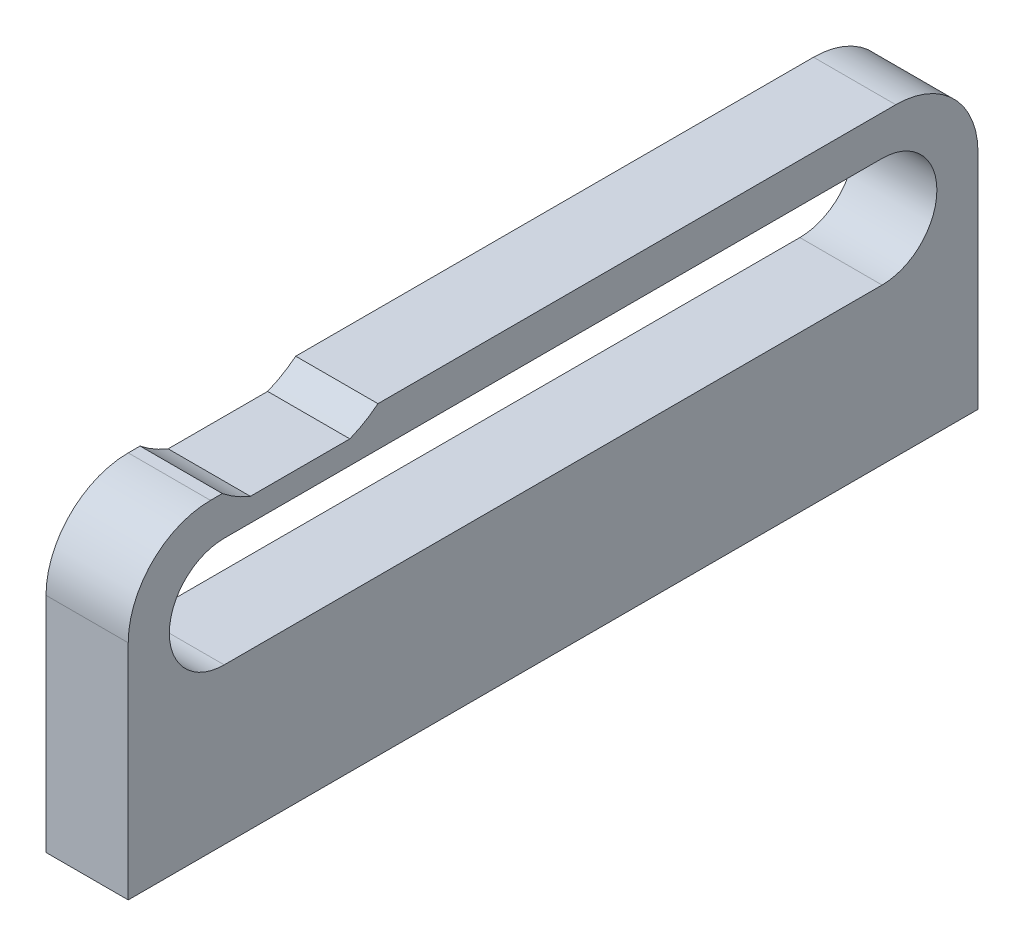
ISO-10303-21;
HEADER;
FILE_DESCRIPTION(('STEP AP214'),'2;1');
FILE_NAME('part.step','',(''),(''),'','','');
FILE_SCHEMA(('AUTOMOTIVE_DESIGN { 1 0 10303 214 1 1 1 1 }'));
ENDSEC;
DATA;
#1=APPLICATION_CONTEXT('core data for automotive mechanical design processes');
#2=APPLICATION_PROTOCOL_DEFINITION('international standard','automotive_design',2000,#1);
#3=PRODUCT_CONTEXT('',#1,'mechanical');
#4=PRODUCT('Part','Part','',(#3));
#5=PRODUCT_RELATED_PRODUCT_CATEGORY('part','',(#4));
#6=PRODUCT_DEFINITION_FORMATION('','',#4);
#7=PRODUCT_DEFINITION_CONTEXT('part definition',#1,'design');
#8=PRODUCT_DEFINITION('design','',#6,#7);
#9=PRODUCT_DEFINITION_SHAPE('','',#8);
#10=(LENGTH_UNIT() NAMED_UNIT(*) SI_UNIT(.MILLI.,.METRE.));
#11=(NAMED_UNIT(*) PLANE_ANGLE_UNIT() SI_UNIT($,.RADIAN.));
#12=(NAMED_UNIT(*) SI_UNIT($,.STERADIAN.) SOLID_ANGLE_UNIT());
#13=UNCERTAINTY_MEASURE_WITH_UNIT(LENGTH_MEASURE(1.E-05),#10,'distance_accuracy_value','');
#14=(GEOMETRIC_REPRESENTATION_CONTEXT(3) GLOBAL_UNCERTAINTY_ASSIGNED_CONTEXT((#13)) GLOBAL_UNIT_ASSIGNED_CONTEXT((#10,
#11,#12)) REPRESENTATION_CONTEXT('',''));
#15=CARTESIAN_POINT('',(0.,0.,0.));
#16=DIRECTION('',(0.,0.,1.));
#17=DIRECTION('',(1.,0.,0.));
#18=AXIS2_PLACEMENT_3D('',#15,#16,#17);
#19=CARTESIAN_POINT('',(0.,20.,0.));
#20=DIRECTION('',(0.,1.,0.));
#21=DIRECTION('',(0.,0.,1.));
#22=AXIS2_PLACEMENT_3D('',#19,#20,#21);
#23=PLANE('',#22);
#24=DIRECTION('',(1.,0.,0.));
#25=VECTOR('',#24,1.);
#26=CARTESIAN_POINT('',(10.,20.,-62.));
#27=LINE('',#26,#25);
#28=CARTESIAN_POINT('',(0.,20.,-62.));
#29=VERTEX_POINT('',#28);
#30=CARTESIAN_POINT('',(6.00000000000001,20.,-62.));
#31=VERTEX_POINT('',#30);
#32=EDGE_CURVE('E248',#29,#31,#27,.T.);
#33=ORIENTED_EDGE('',*,*,#32,.T.);
#34=DIRECTION('',(0.,0.,-1.));
#35=VECTOR('',#34,1.);
#36=CARTESIAN_POINT('',(6.00000000000001,20.,0.));
#37=LINE('',#36,#35);
#38=CARTESIAN_POINT('',(6.00000000000001,20.,-62.8627998142974));
#39=VERTEX_POINT('',#38);
#40=EDGE_CURVE('E268',#31,#39,#37,.T.);
#41=ORIENTED_EDGE('',*,*,#40,.T.);
#42=DIRECTION('',(1.,0.,0.));
#43=VECTOR('',#42,1.);
#44=CARTESIAN_POINT('',(0.,20.,-62.8627998142974));
#45=LINE('',#44,#43);
#46=CARTESIAN_POINT('',(0.,20.,-62.8627998142974));
#47=VERTEX_POINT('',#46);
#48=EDGE_CURVE('E179',#47,#39,#45,.T.);
#49=ORIENTED_EDGE('',*,*,#48,.F.);
#50=DIRECTION('',(0.,0.,1.));
#51=VECTOR('',#50,1.);
#52=CARTESIAN_POINT('',(0.,20.,-118.));
#53=LINE('',#52,#51);
#54=EDGE_CURVE('E190',#47,#29,#53,.T.);
#55=ORIENTED_EDGE('',*,*,#54,.T.);
#56=EDGE_LOOP('',(#33,#41,#49,#55));
#57=FACE_BOUND('',#56,.T.);
#58=ADVANCED_FACE('F43',(#57),#23,.T.);
#59=CARTESIAN_POINT('',(0.,4.,-118.));
#60=DIRECTION('',(0.,0.,1.));
#61=DIRECTION('',(1.,0.,0.));
#62=AXIS2_PLACEMENT_3D('',#59,#60,#61);
#63=PLANE('',#62);
#64=DIRECTION('',(0.,1.,0.));
#65=VECTOR('',#64,1.);
#66=CARTESIAN_POINT('',(6.,4.,-118.));
#67=LINE('',#66,#65);
#68=CARTESIAN_POINT('',(6.,-2.25,-118.));
#69=VERTEX_POINT('',#68);
#70=CARTESIAN_POINT('',(6.,14.,-118.));
#71=VERTEX_POINT('',#70);
#72=EDGE_CURVE('E143',#69,#71,#67,.T.);
#73=ORIENTED_EDGE('',*,*,#72,.F.);
#74=DIRECTION('',(1.,0.,0.));
#75=VECTOR('',#74,1.);
#76=CARTESIAN_POINT('',(0.,-2.25,-118.));
#77=LINE('',#76,#75);
#78=CARTESIAN_POINT('',(0.,-2.25,-118.));
#79=VERTEX_POINT('',#78);
#80=EDGE_CURVE('E153',#79,#69,#77,.T.);
#81=ORIENTED_EDGE('',*,*,#80,.F.);
#82=DIRECTION('',(0.,-1.,0.));
#83=VECTOR('',#82,1.);
#84=CARTESIAN_POINT('',(0.,4.,-118.));
#85=LINE('',#84,#83);
#86=CARTESIAN_POINT('',(0.,14.,-118.));
#87=VERTEX_POINT('',#86);
#88=EDGE_CURVE('E183',#87,#79,#85,.T.);
#89=ORIENTED_EDGE('',*,*,#88,.F.);
#90=DIRECTION('',(-1.,0.,0.));
#91=VECTOR('',#90,1.);
#92=CARTESIAN_POINT('',(10.,14.,-118.));
#93=LINE('',#92,#91);
#94=EDGE_CURVE('E156',#87,#71,#93,.F.);
#95=ORIENTED_EDGE('',*,*,#94,.T.);
#96=EDGE_LOOP('',(#73,#81,#89,#95));
#97=FACE_BOUND('',#96,.T.);
#98=ADVANCED_FACE('F151',(#97),#63,.F.);
#99=CARTESIAN_POINT('',(0.,20.,-56.));
#100=DIRECTION('',(0.,0.,-1.));
#101=DIRECTION('',(-1.,0.,0.));
#102=AXIS2_PLACEMENT_3D('',#99,#100,#101);
#103=PLANE('',#102);
#104=DIRECTION('',(0.,-1.,0.));
#105=VECTOR('',#104,1.);
#106=CARTESIAN_POINT('',(6.00000000000001,20.,-56.));
#107=LINE('',#106,#105);
#108=CARTESIAN_POINT('',(6.00000000000001,14.,-56.));
#109=VERTEX_POINT('',#108);
#110=CARTESIAN_POINT('',(6.,-2.25,-56.));
#111=VERTEX_POINT('',#110);
#112=EDGE_CURVE('E67',#109,#111,#107,.T.);
#113=ORIENTED_EDGE('',*,*,#112,.F.);
#114=DIRECTION('',(1.,0.,0.));
#115=VECTOR('',#114,1.);
#116=CARTESIAN_POINT('',(0.,14.,-56.));
#117=LINE('',#116,#115);
#118=CARTESIAN_POINT('',(0.,14.,-56.));
#119=VERTEX_POINT('',#118);
#120=EDGE_CURVE('E52',#109,#119,#117,.F.);
#121=ORIENTED_EDGE('',*,*,#120,.T.);
#122=DIRECTION('',(0.,-1.,0.));
#123=VECTOR('',#122,1.);
#124=CARTESIAN_POINT('',(0.,20.,-56.));
#125=LINE('',#124,#123);
#126=CARTESIAN_POINT('',(0.,-2.25,-56.));
#127=VERTEX_POINT('',#126);
#128=EDGE_CURVE('E186',#119,#127,#125,.T.);
#129=ORIENTED_EDGE('',*,*,#128,.T.);
#130=DIRECTION('',(-1.,0.,0.));
#131=VECTOR('',#130,1.);
#132=CARTESIAN_POINT('',(0.,-2.25,-56.));
#133=LINE('',#132,#131);
#134=EDGE_CURVE('E164',#111,#127,#133,.T.);
#135=ORIENTED_EDGE('',*,*,#134,.F.);
#136=EDGE_LOOP('',(#113,#121,#129,#135));
#137=FACE_BOUND('',#136,.T.);
#138=ADVANCED_FACE('F255',(#137),#103,.F.);
#139=DIRECTION('',(-1.,0.,0.));
#140=VECTOR('',#139,1.);
#141=CARTESIAN_POINT('',(0.,20.,-74.2191158059225));
#142=LINE('',#141,#140);
#143=CARTESIAN_POINT('',(6.00000000000001,20.,-74.2191158059225));
#144=VERTEX_POINT('',#143);
#145=CARTESIAN_POINT('',(0.,20.,-74.2191158059225));
#146=VERTEX_POINT('',#145);
#147=EDGE_CURVE('E176',#144,#146,#142,.T.);
#148=ORIENTED_EDGE('',*,*,#147,.F.);
#149=DIRECTION('',(0.,0.,-1.));
#150=VECTOR('',#149,1.);
#151=CARTESIAN_POINT('',(6.00000000000001,20.,0.));
#152=LINE('',#151,#150);
#153=CARTESIAN_POINT('',(6.,20.,-112.));
#154=VERTEX_POINT('',#153);
#155=EDGE_CURVE('E297',#144,#154,#152,.T.);
#156=ORIENTED_EDGE('',*,*,#155,.T.);
#157=DIRECTION('',(-1.,0.,0.));
#158=VECTOR('',#157,1.);
#159=CARTESIAN_POINT('',(0.,20.,-112.));
#160=LINE('',#159,#158);
#161=CARTESIAN_POINT('',(0.,20.,-112.));
#162=VERTEX_POINT('',#161);
#163=EDGE_CURVE('E237',#154,#162,#160,.T.);
#164=ORIENTED_EDGE('',*,*,#163,.T.);
#165=EDGE_CURVE('E191',#162,#146,#53,.T.);
#166=ORIENTED_EDGE('',*,*,#165,.T.);
#167=EDGE_LOOP('',(#148,#156,#164,#166));
#168=FACE_BOUND('',#167,.T.);
#169=ADVANCED_FACE('F290',(#168),#23,.T.);
#170=CARTESIAN_POINT('',(110.,13.105440781438,-111.));
#171=DIRECTION('',(-1.,0.,0.));
#172=DIRECTION('',(0.,0.,1.));
#173=AXIS2_PLACEMENT_3D('',#170,#171,#172);
#174=CYLINDRICAL_SURFACE('',#173,4.);
#175=CARTESIAN_POINT('',(6.00000000000001,13.105440781438,-111.));
#176=DIRECTION('',(1.,0.,0.));
#177=DIRECTION('',(0.,0.,-1.));
#178=AXIS2_PLACEMENT_3D('',#175,#176,#177);
#179=CIRCLE('',#178,4.);
#180=CARTESIAN_POINT('',(6.00000000000001,17.105440781438,-111.));
#181=VERTEX_POINT('',#180);
#182=CARTESIAN_POINT('',(6.00000000000001,9.10544078143801,-111.));
#183=VERTEX_POINT('',#182);
#184=EDGE_CURVE('E59',#181,#183,#179,.F.);
#185=ORIENTED_EDGE('',*,*,#184,.F.);
#186=DIRECTION('',(-1.,0.,0.));
#187=VECTOR('',#186,1.);
#188=CARTESIAN_POINT('',(110.,17.105440781438,-111.));
#189=LINE('',#188,#187);
#190=CARTESIAN_POINT('',(0.,17.105440781438,-111.));
#191=VERTEX_POINT('',#190);
#192=EDGE_CURVE('E195',#181,#191,#189,.T.);
#193=ORIENTED_EDGE('',*,*,#192,.T.);
#194=CARTESIAN_POINT('',(0.,13.105440781438,-111.));
#195=DIRECTION('',(-1.,0.,0.));
#196=DIRECTION('',(0.,0.,1.));
#197=AXIS2_PLACEMENT_3D('',#194,#195,#196);
#198=CIRCLE('',#197,4.);
#199=CARTESIAN_POINT('',(0.,9.10544078143802,-111.));
#200=VERTEX_POINT('',#199);
#201=EDGE_CURVE('E209',#191,#200,#198,.T.);
#202=ORIENTED_EDGE('',*,*,#201,.T.);
#203=DIRECTION('',(-1.,0.,0.));
#204=VECTOR('',#203,1.);
#205=CARTESIAN_POINT('',(110.,9.10544078143801,-111.));
#206=LINE('',#205,#204);
#207=EDGE_CURVE('E201',#183,#200,#206,.T.);
#208=ORIENTED_EDGE('',*,*,#207,.F.);
#209=EDGE_LOOP('',(#185,#193,#202,#208));
#210=FACE_BOUND('',#209,.T.);
#211=ADVANCED_FACE('F328',(#210),#174,.F.);
#212=CARTESIAN_POINT('',(110.,17.105440781438,-111.));
#213=DIRECTION('',(0.,1.,0.));
#214=DIRECTION('',(0.,0.,1.));
#215=AXIS2_PLACEMENT_3D('',#212,#213,#214);
#216=PLANE('',#215);
#217=DIRECTION('',(0.,0.,-1.));
#218=VECTOR('',#217,1.);
#219=CARTESIAN_POINT('',(6.00000000000001,17.105440781438,-111.));
#220=LINE('',#219,#218);
#221=CARTESIAN_POINT('',(6.00000000000001,17.105440781438,-63.));
#222=VERTEX_POINT('',#221);
#223=EDGE_CURVE('E318',#222,#181,#220,.T.);
#224=ORIENTED_EDGE('',*,*,#223,.F.);
#225=DIRECTION('',(-1.,0.,0.));
#226=VECTOR('',#225,1.);
#227=CARTESIAN_POINT('',(110.,17.105440781438,-63.));
#228=LINE('',#227,#226);
#229=CARTESIAN_POINT('',(0.,17.105440781438,-63.));
#230=VERTEX_POINT('',#229);
#231=EDGE_CURVE('E219',#222,#230,#228,.T.);
#232=ORIENTED_EDGE('',*,*,#231,.T.);
#233=DIRECTION('',(0.,0.,-1.));
#234=VECTOR('',#233,1.);
#235=CARTESIAN_POINT('',(0.,17.105440781438,-111.));
#236=LINE('',#235,#234);
#237=EDGE_CURVE('E196',#230,#191,#236,.T.);
#238=ORIENTED_EDGE('',*,*,#237,.T.);
#239=ORIENTED_EDGE('',*,*,#192,.F.);
#240=EDGE_LOOP('',(#224,#232,#238,#239));
#241=FACE_BOUND('',#240,.T.);
#242=ADVANCED_FACE('F329',(#241),#216,.F.);
#243=CARTESIAN_POINT('',(110.,13.105440781438,-63.));
#244=DIRECTION('',(-1.,0.,0.));
#245=DIRECTION('',(0.,0.,1.));
#246=AXIS2_PLACEMENT_3D('',#243,#244,#245);
#247=CYLINDRICAL_SURFACE('',#246,4.);
#248=CARTESIAN_POINT('',(6.00000000000001,13.105440781438,-63.));
#249=DIRECTION('',(1.,0.,0.));
#250=DIRECTION('',(0.,0.,-1.));
#251=AXIS2_PLACEMENT_3D('',#248,#249,#250);
#252=CIRCLE('',#251,4.);
#253=CARTESIAN_POINT('',(6.00000000000001,9.10544078143801,-63.));
#254=VERTEX_POINT('',#253);
#255=EDGE_CURVE('E315',#254,#222,#252,.F.);
#256=ORIENTED_EDGE('',*,*,#255,.F.);
#257=DIRECTION('',(-1.,0.,0.));
#258=VECTOR('',#257,1.);
#259=CARTESIAN_POINT('',(110.,9.10544078143801,-63.));
#260=LINE('',#259,#258);
#261=CARTESIAN_POINT('',(0.,9.10544078143801,-63.));
#262=VERTEX_POINT('',#261);
#263=EDGE_CURVE('E216',#254,#262,#260,.T.);
#264=ORIENTED_EDGE('',*,*,#263,.T.);
#265=CARTESIAN_POINT('',(0.,13.105440781438,-63.));
#266=DIRECTION('',(-1.,0.,0.));
#267=DIRECTION('',(0.,0.,1.));
#268=AXIS2_PLACEMENT_3D('',#265,#266,#267);
#269=CIRCLE('',#268,4.);
#270=EDGE_CURVE('E200',#262,#230,#269,.T.);
#271=ORIENTED_EDGE('',*,*,#270,.T.);
#272=ORIENTED_EDGE('',*,*,#231,.F.);
#273=EDGE_LOOP('',(#256,#264,#271,#272));
#274=FACE_BOUND('',#273,.T.);
#275=ADVANCED_FACE('F338',(#274),#247,.F.);
#276=CARTESIAN_POINT('',(110.,9.10544078143801,-111.));
#277=DIRECTION('',(0.,-1.,0.));
#278=DIRECTION('',(0.,0.,-1.));
#279=AXIS2_PLACEMENT_3D('',#276,#277,#278);
#280=PLANE('',#279);
#281=DIRECTION('',(0.,0.,1.));
#282=VECTOR('',#281,1.);
#283=CARTESIAN_POINT('',(6.00000000000001,9.10544078143801,-111.));
#284=LINE('',#283,#282);
#285=EDGE_CURVE('E312',#183,#254,#284,.T.);
#286=ORIENTED_EDGE('',*,*,#285,.F.);
#287=ORIENTED_EDGE('',*,*,#207,.T.);
#288=DIRECTION('',(0.,0.,1.));
#289=VECTOR('',#288,1.);
#290=CARTESIAN_POINT('',(0.,9.10544078143801,-111.));
#291=LINE('',#290,#289);
#292=EDGE_CURVE('E205',#200,#262,#291,.T.);
#293=ORIENTED_EDGE('',*,*,#292,.T.);
#294=ORIENTED_EDGE('',*,*,#263,.F.);
#295=EDGE_LOOP('',(#286,#287,#293,#294));
#296=FACE_BOUND('',#295,.T.);
#297=ADVANCED_FACE('F336',(#296),#280,.F.);
#298=CARTESIAN_POINT('',(0.,18.8,-62.8627998142974));
#299=DIRECTION('',(0.,-1.,0.));
#300=DIRECTION('',(0.,0.,-1.));
#301=AXIS2_PLACEMENT_3D('',#298,#299,#300);
#302=PLANE('',#301);
#303=DIRECTION('',(0.,0.,1.));
#304=VECTOR('',#303,1.);
#305=CARTESIAN_POINT('',(6.00000000000001,18.8,-62.8627998142974));
#306=LINE('',#305,#304);
#307=CARTESIAN_POINT('',(6.00000000000001,18.8,-72.1695176116551));
#308=VERTEX_POINT('',#307);
#309=CARTESIAN_POINT('',(6.00000000000001,18.8,-64.9123980085649));
#310=VERTEX_POINT('',#309);
#311=EDGE_CURVE('E280',#308,#310,#306,.T.);
#312=ORIENTED_EDGE('',*,*,#311,.F.);
#313=DIRECTION('',(1.,0.,0.));
#314=VECTOR('',#313,1.);
#315=CARTESIAN_POINT('',(6.50000000000001,18.8,-72.1695176116551));
#316=LINE('',#315,#314);
#317=CARTESIAN_POINT('',(0.,18.8,-72.1695176116551));
#318=VERTEX_POINT('',#317);
#319=EDGE_CURVE('E227',#308,#318,#316,.F.);
#320=ORIENTED_EDGE('',*,*,#319,.T.);
#321=DIRECTION('',(0.,0.,-1.));
#322=VECTOR('',#321,1.);
#323=CARTESIAN_POINT('',(0.,18.8,-62.8627998142974));
#324=LINE('',#323,#322);
#325=CARTESIAN_POINT('',(0.,18.8,-64.9123980085649));
#326=VERTEX_POINT('',#325);
#327=EDGE_CURVE('E168',#326,#318,#324,.T.);
#328=ORIENTED_EDGE('',*,*,#327,.F.);
#329=DIRECTION('',(-1.,0.,0.));
#330=VECTOR('',#329,1.);
#331=CARTESIAN_POINT('',(0.,18.8,-64.9123980085649));
#332=LINE('',#331,#330);
#333=EDGE_CURVE('E213',#326,#310,#332,.F.);
#334=ORIENTED_EDGE('',*,*,#333,.T.);
#335=EDGE_LOOP('',(#312,#320,#328,#334));
#336=FACE_BOUND('',#335,.T.);
#337=ADVANCED_FACE('F279',(#336),#302,.F.);
#338=CARTESIAN_POINT('',(6.50000000000001,26.2272858112361,-69.1970732508283));
#339=DIRECTION('',(1.,0.,0.));
#340=DIRECTION('',(0.,0.,-1.));
#341=AXIS2_PLACEMENT_3D('',#338,#339,#340);
#342=CYLINDRICAL_SURFACE('',#341,8.);
#343=CARTESIAN_POINT('',(6.00000000000001,26.2272858112361,-69.1970732508283));
#344=DIRECTION('',(1.,0.,0.));
#345=DIRECTION('',(0.,0.,-1.));
#346=AXIS2_PLACEMENT_3D('',#343,#344,#345);
#347=CIRCLE('',#346,8.);
#348=EDGE_CURVE('E287',#144,#308,#347,.F.);
#349=ORIENTED_EDGE('',*,*,#348,.F.);
#350=ORIENTED_EDGE('',*,*,#147,.T.);
#351=CARTESIAN_POINT('',(0.,26.2272858112361,-69.1970732508283));
#352=DIRECTION('',(1.,0.,0.));
#353=DIRECTION('',(0.,0.,-1.));
#354=AXIS2_PLACEMENT_3D('',#351,#352,#353);
#355=CIRCLE('',#354,8.);
#356=EDGE_CURVE('E230',#318,#146,#355,.T.);
#357=ORIENTED_EDGE('',*,*,#356,.F.);
#358=ORIENTED_EDGE('',*,*,#319,.F.);
#359=EDGE_LOOP('',(#349,#350,#357,#358));
#360=FACE_BOUND('',#359,.T.);
#361=ADVANCED_FACE('F285',(#360),#342,.F.);
#362=CARTESIAN_POINT('',(6.50000000000001,26.2272858112361,-67.8848423693917));
#363=DIRECTION('',(-1.,0.,0.));
#364=DIRECTION('',(0.,0.,1.));
#365=AXIS2_PLACEMENT_3D('',#362,#363,#364);
#366=CYLINDRICAL_SURFACE('',#365,8.);
#367=CARTESIAN_POINT('',(6.00000000000001,26.2272858112361,-67.8848423693917));
#368=DIRECTION('',(1.,0.,0.));
#369=DIRECTION('',(0.,0.,-1.));
#370=AXIS2_PLACEMENT_3D('',#367,#368,#369);
#371=CIRCLE('',#370,8.);
#372=EDGE_CURVE('E276',#310,#39,#371,.F.);
#373=ORIENTED_EDGE('',*,*,#372,.F.);
#374=ORIENTED_EDGE('',*,*,#333,.F.);
#375=CARTESIAN_POINT('',(0.,26.2272858112361,-67.8848423693917));
#376=DIRECTION('',(1.,0.,0.));
#377=DIRECTION('',(0.,0.,-1.));
#378=AXIS2_PLACEMENT_3D('',#375,#376,#377);
#379=CIRCLE('',#378,8.);
#380=EDGE_CURVE('E234',#47,#326,#379,.T.);
#381=ORIENTED_EDGE('',*,*,#380,.F.);
#382=ORIENTED_EDGE('',*,*,#48,.T.);
#383=EDGE_LOOP('',(#373,#374,#381,#382));
#384=FACE_BOUND('',#383,.T.);
#385=ADVANCED_FACE('F275',(#384),#366,.F.);
#386=CARTESIAN_POINT('',(0.,14.,-112.));
#387=DIRECTION('',(1.,0.,0.));
#388=DIRECTION('',(0.,0.,-1.));
#389=AXIS2_PLACEMENT_3D('',#386,#387,#388);
#390=CYLINDRICAL_SURFACE('',#389,6.);
#391=ORIENTED_EDGE('',*,*,#163,.F.);
#392=CARTESIAN_POINT('',(6.,14.,-112.));
#393=DIRECTION('',(1.,0.,0.));
#394=DIRECTION('',(0.,0.,-1.));
#395=AXIS2_PLACEMENT_3D('',#392,#393,#394);
#396=CIRCLE('',#395,6.);
#397=EDGE_CURVE('E295',#154,#71,#396,.F.);
#398=ORIENTED_EDGE('',*,*,#397,.T.);
#399=ORIENTED_EDGE('',*,*,#94,.F.);
#400=CARTESIAN_POINT('',(0.,14.,-112.));
#401=DIRECTION('',(1.,0.,0.));
#402=DIRECTION('',(0.,0.,-1.));
#403=AXIS2_PLACEMENT_3D('',#400,#401,#402);
#404=CIRCLE('',#403,6.);
#405=EDGE_CURVE('E243',#162,#87,#404,.F.);
#406=ORIENTED_EDGE('',*,*,#405,.F.);
#407=EDGE_LOOP('',(#391,#398,#399,#406));
#408=FACE_BOUND('',#407,.T.);
#409=ADVANCED_FACE('F294',(#408),#390,.T.);
#410=CARTESIAN_POINT('',(0.,14.,-62.));
#411=DIRECTION('',(-1.,0.,0.));
#412=DIRECTION('',(0.,0.,1.));
#413=AXIS2_PLACEMENT_3D('',#410,#411,#412);
#414=CYLINDRICAL_SURFACE('',#413,6.);
#415=ORIENTED_EDGE('',*,*,#120,.F.);
#416=CARTESIAN_POINT('',(6.00000000000001,14.,-62.));
#417=DIRECTION('',(1.,0.,0.));
#418=DIRECTION('',(0.,0.,-1.));
#419=AXIS2_PLACEMENT_3D('',#416,#417,#418);
#420=CIRCLE('',#419,6.);
#421=EDGE_CURVE('E158',#109,#31,#420,.F.);
#422=ORIENTED_EDGE('',*,*,#421,.T.);
#423=ORIENTED_EDGE('',*,*,#32,.F.);
#424=CARTESIAN_POINT('',(0.,14.,-62.));
#425=DIRECTION('',(1.,0.,0.));
#426=DIRECTION('',(0.,0.,-1.));
#427=AXIS2_PLACEMENT_3D('',#424,#425,#426);
#428=CIRCLE('',#427,6.);
#429=EDGE_CURVE('E240',#119,#29,#428,.F.);
#430=ORIENTED_EDGE('',*,*,#429,.F.);
#431=EDGE_LOOP('',(#415,#422,#423,#430));
#432=FACE_BOUND('',#431,.T.);
#433=ADVANCED_FACE('F45',(#432),#414,.T.);
#434=CARTESIAN_POINT('',(0.,-2.25,0.));
#435=DIRECTION('',(0.,-1.,0.));
#436=DIRECTION('',(0.,0.,-1.));
#437=AXIS2_PLACEMENT_3D('',#434,#435,#436);
#438=PLANE('',#437);
#439=ORIENTED_EDGE('',*,*,#80,.T.);
#440=DIRECTION('',(0.,0.,1.));
#441=VECTOR('',#440,1.);
#442=CARTESIAN_POINT('',(6.00000000000001,-2.25,0.));
#443=LINE('',#442,#441);
#444=EDGE_CURVE('E11',#69,#111,#443,.T.);
#445=ORIENTED_EDGE('',*,*,#444,.T.);
#446=ORIENTED_EDGE('',*,*,#134,.T.);
#447=DIRECTION('',(0.,0.,-1.));
#448=VECTOR('',#447,1.);
#449=CARTESIAN_POINT('',(0.,-2.25,-56.));
#450=LINE('',#449,#448);
#451=EDGE_CURVE('E162',#127,#79,#450,.T.);
#452=ORIENTED_EDGE('',*,*,#451,.T.);
#453=EDGE_LOOP('',(#439,#445,#446,#452));
#454=FACE_BOUND('',#453,.T.);
#455=ADVANCED_FACE('F160',(#454),#438,.T.);
#456=CARTESIAN_POINT('',(0.,4.,0.));
#457=DIRECTION('',(1.,0.,0.));
#458=DIRECTION('',(0.,0.,-1.));
#459=AXIS2_PLACEMENT_3D('',#456,#457,#458);
#460=PLANE('',#459);
#461=ORIENTED_EDGE('',*,*,#165,.F.);
#462=ORIENTED_EDGE('',*,*,#405,.T.);
#463=ORIENTED_EDGE('',*,*,#88,.T.);
#464=ORIENTED_EDGE('',*,*,#451,.F.);
#465=ORIENTED_EDGE('',*,*,#128,.F.);
#466=ORIENTED_EDGE('',*,*,#429,.T.);
#467=ORIENTED_EDGE('',*,*,#54,.F.);
#468=ORIENTED_EDGE('',*,*,#380,.T.);
#469=ORIENTED_EDGE('',*,*,#327,.T.);
#470=ORIENTED_EDGE('',*,*,#356,.T.);
#471=EDGE_LOOP('',(#461,#462,#463,#464,#465,#466,#467,#468,#469,#470));
#472=FACE_BOUND('',#471,.T.);
#473=ORIENTED_EDGE('',*,*,#292,.F.);
#474=ORIENTED_EDGE('',*,*,#201,.F.);
#475=ORIENTED_EDGE('',*,*,#237,.F.);
#476=ORIENTED_EDGE('',*,*,#270,.F.);
#477=EDGE_LOOP('',(#473,#474,#475,#476));
#478=FACE_BOUND('',#477,.T.);
#479=ADVANCED_FACE('F261',(#472,#478),#460,.F.);
#480=CARTESIAN_POINT('',(6.00000000000001,0.,0.));
#481=DIRECTION('',(1.,0.,0.));
#482=DIRECTION('',(0.,0.,-1.));
#483=AXIS2_PLACEMENT_3D('',#480,#481,#482);
#484=PLANE('',#483);
#485=ORIENTED_EDGE('',*,*,#311,.T.);
#486=ORIENTED_EDGE('',*,*,#372,.T.);
#487=ORIENTED_EDGE('',*,*,#40,.F.);
#488=ORIENTED_EDGE('',*,*,#421,.F.);
#489=ORIENTED_EDGE('',*,*,#112,.T.);
#490=ORIENTED_EDGE('',*,*,#444,.F.);
#491=ORIENTED_EDGE('',*,*,#72,.T.);
#492=ORIENTED_EDGE('',*,*,#397,.F.);
#493=ORIENTED_EDGE('',*,*,#155,.F.);
#494=ORIENTED_EDGE('',*,*,#348,.T.);
#495=EDGE_LOOP('',(#485,#486,#487,#488,#489,#490,#491,#492,#493,#494));
#496=FACE_BOUND('',#495,.T.);
#497=ORIENTED_EDGE('',*,*,#184,.T.);
#498=ORIENTED_EDGE('',*,*,#285,.T.);
#499=ORIENTED_EDGE('',*,*,#255,.T.);
#500=ORIENTED_EDGE('',*,*,#223,.T.);
#501=EDGE_LOOP('',(#497,#498,#499,#500));
#502=FACE_BOUND('',#501,.T.);
#503=ADVANCED_FACE('F142',(#496,#502),#484,.T.);
#504=CLOSED_SHELL('',(#58,#98,#138,#169,#211,#242,#275,#297,#337,#361,#385,#409,#433,#455,#479,#503));
#505=MANIFOLD_SOLID_BREP('B2',#504);
#506=ADVANCED_BREP_SHAPE_REPRESENTATION('',(#18,#505),#14);
#507=SHAPE_DEFINITION_REPRESENTATION(#9,#506);
ENDSEC;
END-ISO-10303-21;
